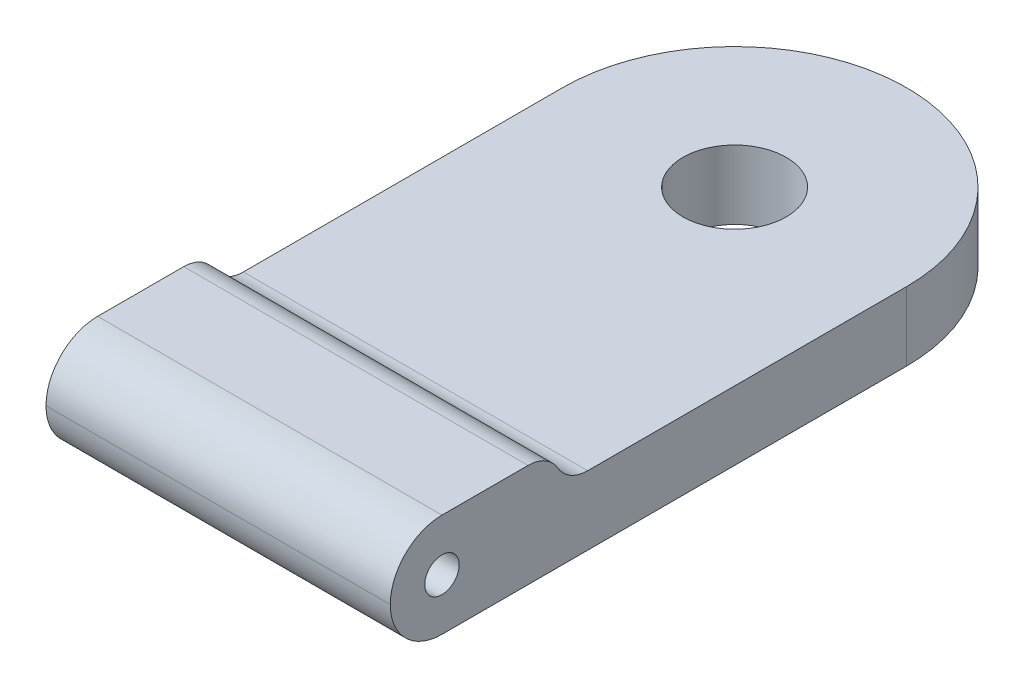
ISO-10303-21;
HEADER;
FILE_DESCRIPTION(('STEP AP214'),'2;1');
FILE_NAME('part.step','',(''),(''),'','','');
FILE_SCHEMA(('AUTOMOTIVE_DESIGN { 1 0 10303 214 1 1 1 1 }'));
ENDSEC;
DATA;
#1=APPLICATION_CONTEXT('core data for automotive mechanical design processes');
#2=APPLICATION_PROTOCOL_DEFINITION('international standard','automotive_design',2000,#1);
#3=PRODUCT_CONTEXT('',#1,'mechanical');
#4=PRODUCT('Part','Part','',(#3));
#5=PRODUCT_RELATED_PRODUCT_CATEGORY('part','',(#4));
#6=PRODUCT_DEFINITION_FORMATION('','',#4);
#7=PRODUCT_DEFINITION_CONTEXT('part definition',#1,'design');
#8=PRODUCT_DEFINITION('design','',#6,#7);
#9=PRODUCT_DEFINITION_SHAPE('','',#8);
#10=(LENGTH_UNIT() NAMED_UNIT(*) SI_UNIT(.MILLI.,.METRE.));
#11=(NAMED_UNIT(*) PLANE_ANGLE_UNIT() SI_UNIT($,.RADIAN.));
#12=(NAMED_UNIT(*) SI_UNIT($,.STERADIAN.) SOLID_ANGLE_UNIT());
#13=UNCERTAINTY_MEASURE_WITH_UNIT(LENGTH_MEASURE(1.E-05),#10,'distance_accuracy_value','');
#14=(GEOMETRIC_REPRESENTATION_CONTEXT(3) GLOBAL_UNCERTAINTY_ASSIGNED_CONTEXT((#13)) GLOBAL_UNIT_ASSIGNED_CONTEXT((#10,
#11,#12)) REPRESENTATION_CONTEXT('',''));
#15=CARTESIAN_POINT('',(0.,0.,0.));
#16=DIRECTION('',(0.,0.,1.));
#17=DIRECTION('',(1.,0.,0.));
#18=AXIS2_PLACEMENT_3D('',#15,#16,#17);
#19=CARTESIAN_POINT('',(5.,3.,-15.));
#20=DIRECTION('',(0.,-1.,0.));
#21=DIRECTION('',(0.,0.,-1.));
#22=AXIS2_PLACEMENT_3D('',#19,#20,#21);
#23=CYLINDRICAL_SURFACE('',#22,5.);
#24=CARTESIAN_POINT('',(5.,2.,-15.));
#25=DIRECTION('',(0.,1.,0.));
#26=DIRECTION('',(0.,0.,1.));
#27=AXIS2_PLACEMENT_3D('',#24,#25,#26);
#28=CIRCLE('',#27,5.);
#29=CARTESIAN_POINT('',(10.,2.,-15.));
#30=VERTEX_POINT('',#29);
#31=CARTESIAN_POINT('',(0.,2.,-15.));
#32=VERTEX_POINT('',#31);
#33=EDGE_CURVE('E104',#30,#32,#28,.T.);
#34=ORIENTED_EDGE('',*,*,#33,.F.);
#35=DIRECTION('',(0.,-1.,0.));
#36=VECTOR('',#35,1.);
#37=CARTESIAN_POINT('',(10.,3.,-15.));
#38=LINE('',#37,#36);
#39=CARTESIAN_POINT('',(10.,0.,-15.));
#40=VERTEX_POINT('',#39);
#41=EDGE_CURVE('E115',#30,#40,#38,.T.);
#42=ORIENTED_EDGE('',*,*,#41,.T.);
#43=CARTESIAN_POINT('',(5.,0.,-15.));
#44=DIRECTION('',(0.,1.,0.));
#45=DIRECTION('',(0.,0.,1.));
#46=AXIS2_PLACEMENT_3D('',#43,#44,#45);
#47=CIRCLE('',#46,5.);
#48=CARTESIAN_POINT('',(0.,0.,-15.));
#49=VERTEX_POINT('',#48);
#50=EDGE_CURVE('E118',#40,#49,#47,.T.);
#51=ORIENTED_EDGE('',*,*,#50,.T.);
#52=DIRECTION('',(0.,-1.,0.));
#53=VECTOR('',#52,1.);
#54=CARTESIAN_POINT('',(0.,3.,-15.));
#55=LINE('',#54,#53);
#56=EDGE_CURVE('E117',#32,#49,#55,.T.);
#57=ORIENTED_EDGE('',*,*,#56,.F.);
#58=EDGE_LOOP('',(#34,#42,#51,#57));
#59=FACE_BOUND('',#58,.T.);
#60=ADVANCED_FACE('F36',(#59),#23,.T.);
#61=CARTESIAN_POINT('',(0.,3.,0.));
#62=DIRECTION('',(1.,0.,0.));
#63=DIRECTION('',(0.,0.,-1.));
#64=AXIS2_PLACEMENT_3D('',#61,#62,#63);
#65=PLANE('',#64);
#66=CARTESIAN_POINT('',(0.,1.5,-1.5));
#67=DIRECTION('',(1.,0.,0.));
#68=DIRECTION('',(0.,0.,-1.));
#69=AXIS2_PLACEMENT_3D('',#66,#67,#68);
#70=CIRCLE('',#69,0.5);
#71=CARTESIAN_POINT('',(0.,1.5,-2.));
#72=VERTEX_POINT('',#71);
#73=EDGE_CURVE('E177',#72,#72,#70,.F.);
#74=ORIENTED_EDGE('',*,*,#73,.F.);
#75=EDGE_LOOP('',(#74));
#76=FACE_BOUND('',#75,.T.);
#77=DIRECTION('',(0.,0.,1.));
#78=VECTOR('',#77,1.);
#79=CARTESIAN_POINT('',(0.,0.,0.));
#80=LINE('',#79,#78);
#81=CARTESIAN_POINT('',(0.,0.,-1.5));
#82=VERTEX_POINT('',#81);
#83=EDGE_CURVE('E232',#49,#82,#80,.T.);
#84=ORIENTED_EDGE('',*,*,#83,.T.);
#85=CARTESIAN_POINT('',(0.,1.5,-1.5));
#86=DIRECTION('',(1.,0.,0.));
#87=DIRECTION('',(0.,0.,-1.));
#88=AXIS2_PLACEMENT_3D('',#85,#86,#87);
#89=CIRCLE('',#88,1.5);
#90=CARTESIAN_POINT('',(0.,1.5,0.));
#91=VERTEX_POINT('',#90);
#92=EDGE_CURVE('E11',#82,#91,#89,.F.);
#93=ORIENTED_EDGE('',*,*,#92,.T.);
#94=CARTESIAN_POINT('',(0.,1.5,-1.5));
#95=DIRECTION('',(1.,0.,0.));
#96=DIRECTION('',(0.,0.,-1.));
#97=AXIS2_PLACEMENT_3D('',#94,#95,#96);
#98=CIRCLE('',#97,1.5);
#99=CARTESIAN_POINT('',(0.,3.,-1.5));
#100=VERTEX_POINT('',#99);
#101=EDGE_CURVE('E155',#91,#100,#98,.F.);
#102=ORIENTED_EDGE('',*,*,#101,.T.);
#103=DIRECTION('',(0.,0.,1.));
#104=VECTOR('',#103,1.);
#105=CARTESIAN_POINT('',(0.,3.,0.));
#106=LINE('',#105,#104);
#107=CARTESIAN_POINT('',(0.,3.,-4.));
#108=VERTEX_POINT('',#107);
#109=EDGE_CURVE('E126',#108,#100,#106,.T.);
#110=ORIENTED_EDGE('',*,*,#109,.F.);
#111=CARTESIAN_POINT('',(0.,2.,-4.));
#112=DIRECTION('',(1.,0.,0.));
#113=DIRECTION('',(0.,0.,-1.));
#114=AXIS2_PLACEMENT_3D('',#111,#112,#113);
#115=CIRCLE('',#114,1.);
#116=CARTESIAN_POINT('',(0.,2.5,-4.86602540378444));
#117=VERTEX_POINT('',#116);
#118=EDGE_CURVE('E133',#108,#117,#115,.F.);
#119=ORIENTED_EDGE('',*,*,#118,.T.);
#120=CARTESIAN_POINT('',(0.,3.,-5.73205080756887));
#121=DIRECTION('',(1.,0.,0.));
#122=DIRECTION('',(0.,0.,-1.));
#123=AXIS2_PLACEMENT_3D('',#120,#121,#122);
#124=CIRCLE('',#123,1.);
#125=CARTESIAN_POINT('',(0.,2.,-5.73205080756887));
#126=VERTEX_POINT('',#125);
#127=EDGE_CURVE('E143',#117,#126,#124,.T.);
#128=ORIENTED_EDGE('',*,*,#127,.T.);
#129=DIRECTION('',(0.,0.,-1.));
#130=VECTOR('',#129,1.);
#131=CARTESIAN_POINT('',(0.,2.,-5.));
#132=LINE('',#131,#130);
#133=EDGE_CURVE('E110',#126,#32,#132,.T.);
#134=ORIENTED_EDGE('',*,*,#133,.T.);
#135=ORIENTED_EDGE('',*,*,#56,.T.);
#136=EDGE_LOOP('',(#84,#93,#102,#110,#119,#128,#134,#135));
#137=FACE_BOUND('',#136,.T.);
#138=ADVANCED_FACE('F161',(#76,#137),#65,.F.);
#139=CARTESIAN_POINT('',(10.,3.,0.));
#140=DIRECTION('',(-1.,0.,0.));
#141=DIRECTION('',(0.,0.,1.));
#142=AXIS2_PLACEMENT_3D('',#139,#140,#141);
#143=PLANE('',#142);
#144=CARTESIAN_POINT('',(10.,1.5,-1.5));
#145=DIRECTION('',(1.,0.,0.));
#146=DIRECTION('',(0.,0.,-1.));
#147=AXIS2_PLACEMENT_3D('',#144,#145,#146);
#148=CIRCLE('',#147,0.5);
#149=CARTESIAN_POINT('',(10.,1.5,-2.));
#150=VERTEX_POINT('',#149);
#151=EDGE_CURVE('E224',#150,#150,#148,.T.);
#152=ORIENTED_EDGE('',*,*,#151,.F.);
#153=EDGE_LOOP('',(#152));
#154=FACE_BOUND('',#153,.T.);
#155=CARTESIAN_POINT('',(10.,1.5,-1.5));
#156=DIRECTION('',(-1.,0.,0.));
#157=DIRECTION('',(0.,0.,1.));
#158=AXIS2_PLACEMENT_3D('',#155,#156,#157);
#159=CIRCLE('',#158,1.5);
#160=CARTESIAN_POINT('',(10.,3.,-1.5));
#161=VERTEX_POINT('',#160);
#162=CARTESIAN_POINT('',(10.,1.5,0.));
#163=VERTEX_POINT('',#162);
#164=EDGE_CURVE('E150',#161,#163,#159,.F.);
#165=ORIENTED_EDGE('',*,*,#164,.T.);
#166=CARTESIAN_POINT('',(10.,1.5,-1.5));
#167=DIRECTION('',(-1.,0.,0.));
#168=DIRECTION('',(0.,0.,1.));
#169=AXIS2_PLACEMENT_3D('',#166,#167,#168);
#170=CIRCLE('',#169,1.5);
#171=CARTESIAN_POINT('',(10.,0.,-1.5));
#172=VERTEX_POINT('',#171);
#173=EDGE_CURVE('E58',#163,#172,#170,.F.);
#174=ORIENTED_EDGE('',*,*,#173,.T.);
#175=DIRECTION('',(0.,0.,-1.));
#176=VECTOR('',#175,1.);
#177=CARTESIAN_POINT('',(10.,0.,0.));
#178=LINE('',#177,#176);
#179=EDGE_CURVE('E121',#172,#40,#178,.T.);
#180=ORIENTED_EDGE('',*,*,#179,.T.);
#181=ORIENTED_EDGE('',*,*,#41,.F.);
#182=DIRECTION('',(0.,0.,1.));
#183=VECTOR('',#182,1.);
#184=CARTESIAN_POINT('',(10.,2.,-5.));
#185=LINE('',#184,#183);
#186=CARTESIAN_POINT('',(10.,2.,-5.73205080756887));
#187=VERTEX_POINT('',#186);
#188=EDGE_CURVE('E100',#30,#187,#185,.T.);
#189=ORIENTED_EDGE('',*,*,#188,.T.);
#190=CARTESIAN_POINT('',(10.,3.,-5.73205080756887));
#191=DIRECTION('',(-1.,0.,0.));
#192=DIRECTION('',(0.,0.,1.));
#193=AXIS2_PLACEMENT_3D('',#190,#191,#192);
#194=CIRCLE('',#193,1.);
#195=CARTESIAN_POINT('',(10.,2.5,-4.86602540378444));
#196=VERTEX_POINT('',#195);
#197=EDGE_CURVE('E145',#187,#196,#194,.T.);
#198=ORIENTED_EDGE('',*,*,#197,.T.);
#199=CARTESIAN_POINT('',(10.,2.,-4.));
#200=DIRECTION('',(-1.,0.,0.));
#201=DIRECTION('',(0.,0.,1.));
#202=AXIS2_PLACEMENT_3D('',#199,#200,#201);
#203=CIRCLE('',#202,1.);
#204=CARTESIAN_POINT('',(10.,3.,-4.));
#205=VERTEX_POINT('',#204);
#206=EDGE_CURVE('E136',#196,#205,#203,.F.);
#207=ORIENTED_EDGE('',*,*,#206,.T.);
#208=DIRECTION('',(0.,0.,-1.));
#209=VECTOR('',#208,1.);
#210=CARTESIAN_POINT('',(10.,3.,0.));
#211=LINE('',#210,#209);
#212=EDGE_CURVE('E122',#161,#205,#211,.T.);
#213=ORIENTED_EDGE('',*,*,#212,.F.);
#214=EDGE_LOOP('',(#165,#174,#180,#181,#189,#198,#207,#213));
#215=FACE_BOUND('',#214,.T.);
#216=ADVANCED_FACE('F120',(#154,#215),#143,.F.);
#217=CARTESIAN_POINT('',(5.,3.,-15.));
#218=DIRECTION('',(0.,1.,0.));
#219=DIRECTION('',(0.,0.,1.));
#220=AXIS2_PLACEMENT_3D('',#217,#218,#219);
#221=PLANE('',#220);
#222=ORIENTED_EDGE('',*,*,#109,.T.);
#223=DIRECTION('',(1.,0.,0.));
#224=VECTOR('',#223,1.);
#225=CARTESIAN_POINT('',(10.,3.,-1.5));
#226=LINE('',#225,#224);
#227=EDGE_CURVE('E147',#100,#161,#226,.T.);
#228=ORIENTED_EDGE('',*,*,#227,.T.);
#229=ORIENTED_EDGE('',*,*,#212,.T.);
#230=DIRECTION('',(-1.,0.,0.));
#231=VECTOR('',#230,1.);
#232=CARTESIAN_POINT('',(5.,3.,-4.));
#233=LINE('',#232,#231);
#234=EDGE_CURVE('E124',#205,#108,#233,.T.);
#235=ORIENTED_EDGE('',*,*,#234,.T.);
#236=EDGE_LOOP('',(#222,#228,#229,#235));
#237=FACE_BOUND('',#236,.T.);
#238=ADVANCED_FACE('F167',(#237),#221,.T.);
#239=CARTESIAN_POINT('',(5.,0.,-15.));
#240=DIRECTION('',(0.,1.,0.));
#241=DIRECTION('',(0.,0.,1.));
#242=AXIS2_PLACEMENT_3D('',#239,#240,#241);
#243=PLANE('',#242);
#244=CARTESIAN_POINT('',(5.,0.,-15.));
#245=DIRECTION('',(0.,1.,0.));
#246=DIRECTION('',(0.,0.,1.));
#247=AXIS2_PLACEMENT_3D('',#244,#245,#246);
#248=CIRCLE('',#247,1.5);
#249=CARTESIAN_POINT('',(5.,0.,-13.5));
#250=VERTEX_POINT('',#249);
#251=EDGE_CURVE('E223',#250,#250,#248,.T.);
#252=ORIENTED_EDGE('',*,*,#251,.T.);
#253=EDGE_LOOP('',(#252));
#254=FACE_BOUND('',#253,.T.);
#255=ORIENTED_EDGE('',*,*,#179,.F.);
#256=DIRECTION('',(1.,0.,0.));
#257=VECTOR('',#256,1.);
#258=CARTESIAN_POINT('',(5.,0.,-1.5));
#259=LINE('',#258,#257);
#260=EDGE_CURVE('E44',#172,#82,#259,.F.);
#261=ORIENTED_EDGE('',*,*,#260,.T.);
#262=ORIENTED_EDGE('',*,*,#83,.F.);
#263=ORIENTED_EDGE('',*,*,#50,.F.);
#264=EDGE_LOOP('',(#255,#261,#262,#263));
#265=FACE_BOUND('',#264,.T.);
#266=ADVANCED_FACE('F201',(#254,#265),#243,.F.);
#267=CARTESIAN_POINT('',(25.0332963783729,2.,-5.));
#268=DIRECTION('',(0.,1.,0.));
#269=DIRECTION('',(0.,0.,1.));
#270=AXIS2_PLACEMENT_3D('',#267,#268,#269);
#271=PLANE('',#270);
#272=CARTESIAN_POINT('',(5.,2.,-15.));
#273=DIRECTION('',(0.,1.,0.));
#274=DIRECTION('',(0.,0.,1.));
#275=AXIS2_PLACEMENT_3D('',#272,#273,#274);
#276=CIRCLE('',#275,1.5);
#277=CARTESIAN_POINT('',(5.,2.,-13.5));
#278=VERTEX_POINT('',#277);
#279=EDGE_CURVE('E220',#278,#278,#276,.T.);
#280=ORIENTED_EDGE('',*,*,#279,.F.);
#281=EDGE_LOOP('',(#280));
#282=FACE_BOUND('',#281,.T.);
#283=ORIENTED_EDGE('',*,*,#133,.F.);
#284=DIRECTION('',(1.,0.,0.));
#285=VECTOR('',#284,1.);
#286=CARTESIAN_POINT('',(10.,2.,-5.73205080756887));
#287=LINE('',#286,#285);
#288=EDGE_CURVE('E107',#126,#187,#287,.T.);
#289=ORIENTED_EDGE('',*,*,#288,.T.);
#290=ORIENTED_EDGE('',*,*,#188,.F.);
#291=ORIENTED_EDGE('',*,*,#33,.T.);
#292=EDGE_LOOP('',(#283,#289,#290,#291));
#293=FACE_BOUND('',#292,.T.);
#294=ADVANCED_FACE('F103',(#282,#293),#271,.T.);
#295=CARTESIAN_POINT('',(5.,2.,-4.));
#296=DIRECTION('',(-1.,0.,0.));
#297=DIRECTION('',(0.,0.,1.));
#298=AXIS2_PLACEMENT_3D('',#295,#296,#297);
#299=CYLINDRICAL_SURFACE('',#298,1.);
#300=ORIENTED_EDGE('',*,*,#206,.F.);
#301=DIRECTION('',(-1.,0.,0.));
#302=VECTOR('',#301,1.);
#303=CARTESIAN_POINT('',(5.,2.5,-4.86602540378444));
#304=LINE('',#303,#302);
#305=EDGE_CURVE('E139',#196,#117,#304,.T.);
#306=ORIENTED_EDGE('',*,*,#305,.T.);
#307=ORIENTED_EDGE('',*,*,#118,.F.);
#308=ORIENTED_EDGE('',*,*,#234,.F.);
#309=EDGE_LOOP('',(#300,#306,#307,#308));
#310=FACE_BOUND('',#309,.T.);
#311=ADVANCED_FACE('F175',(#310),#299,.T.);
#312=CARTESIAN_POINT('',(5.,3.,-5.73205080756887));
#313=DIRECTION('',(-1.,0.,0.));
#314=DIRECTION('',(0.,0.,1.));
#315=AXIS2_PLACEMENT_3D('',#312,#313,#314);
#316=CYLINDRICAL_SURFACE('',#315,1.);
#317=ORIENTED_EDGE('',*,*,#197,.F.);
#318=ORIENTED_EDGE('',*,*,#288,.F.);
#319=ORIENTED_EDGE('',*,*,#127,.F.);
#320=ORIENTED_EDGE('',*,*,#305,.F.);
#321=EDGE_LOOP('',(#317,#318,#319,#320));
#322=FACE_BOUND('',#321,.T.);
#323=ADVANCED_FACE('F179',(#322),#316,.F.);
#324=CARTESIAN_POINT('',(-1.41421356237309,1.5,-1.5));
#325=DIRECTION('',(1.,0.,0.));
#326=DIRECTION('',(0.,0.,-1.));
#327=AXIS2_PLACEMENT_3D('',#324,#325,#326);
#328=CYLINDRICAL_SURFACE('',#327,0.5);
#329=ORIENTED_EDGE('',*,*,#73,.T.);
#330=EDGE_LOOP('',(#329));
#331=FACE_BOUND('',#330,.T.);
#332=ORIENTED_EDGE('',*,*,#151,.T.);
#333=EDGE_LOOP('',(#332));
#334=FACE_BOUND('',#333,.T.);
#335=ADVANCED_FACE('F181',(#331,#334),#328,.F.);
#336=CARTESIAN_POINT('',(5.,1.5,-1.5));
#337=DIRECTION('',(-1.,0.,0.));
#338=DIRECTION('',(0.,0.,1.));
#339=AXIS2_PLACEMENT_3D('',#336,#337,#338);
#340=CYLINDRICAL_SURFACE('',#339,1.5);
#341=ORIENTED_EDGE('',*,*,#101,.F.);
#342=DIRECTION('',(1.,0.,0.));
#343=VECTOR('',#342,1.);
#344=CARTESIAN_POINT('',(0.,1.5,0.));
#345=LINE('',#344,#343);
#346=EDGE_CURVE('E152',#163,#91,#345,.F.);
#347=ORIENTED_EDGE('',*,*,#346,.F.);
#348=ORIENTED_EDGE('',*,*,#164,.F.);
#349=ORIENTED_EDGE('',*,*,#227,.F.);
#350=EDGE_LOOP('',(#341,#347,#348,#349));
#351=FACE_BOUND('',#350,.T.);
#352=ADVANCED_FACE('F171',(#351),#340,.T.);
#353=CARTESIAN_POINT('',(0.,1.5,-1.5));
#354=DIRECTION('',(1.,0.,0.));
#355=DIRECTION('',(0.,0.,-1.));
#356=AXIS2_PLACEMENT_3D('',#353,#354,#355);
#357=CYLINDRICAL_SURFACE('',#356,1.5);
#358=ORIENTED_EDGE('',*,*,#92,.F.);
#359=ORIENTED_EDGE('',*,*,#260,.F.);
#360=ORIENTED_EDGE('',*,*,#173,.F.);
#361=ORIENTED_EDGE('',*,*,#346,.T.);
#362=EDGE_LOOP('',(#358,#359,#360,#361));
#363=FACE_BOUND('',#362,.T.);
#364=ADVANCED_FACE('F38',(#363),#357,.T.);
#365=CARTESIAN_POINT('',(5.,-1.,-15.));
#366=DIRECTION('',(0.,1.,0.));
#367=DIRECTION('',(0.,0.,1.));
#368=AXIS2_PLACEMENT_3D('',#365,#366,#367);
#369=CYLINDRICAL_SURFACE('',#368,1.5);
#370=ORIENTED_EDGE('',*,*,#279,.T.);
#371=EDGE_LOOP('',(#370));
#372=FACE_BOUND('',#371,.T.);
#373=ORIENTED_EDGE('',*,*,#251,.F.);
#374=EDGE_LOOP('',(#373));
#375=FACE_BOUND('',#374,.T.);
#376=ADVANCED_FACE('F210',(#372,#375),#369,.F.);
#377=CLOSED_SHELL('',(#60,#138,#216,#238,#266,#294,#311,#323,#335,#352,#364,#376));
#378=MANIFOLD_SOLID_BREP('B2',#377);
#379=ADVANCED_BREP_SHAPE_REPRESENTATION('',(#18,#378),#14);
#380=SHAPE_DEFINITION_REPRESENTATION(#9,#379);
ENDSEC;
END-ISO-10303-21;
